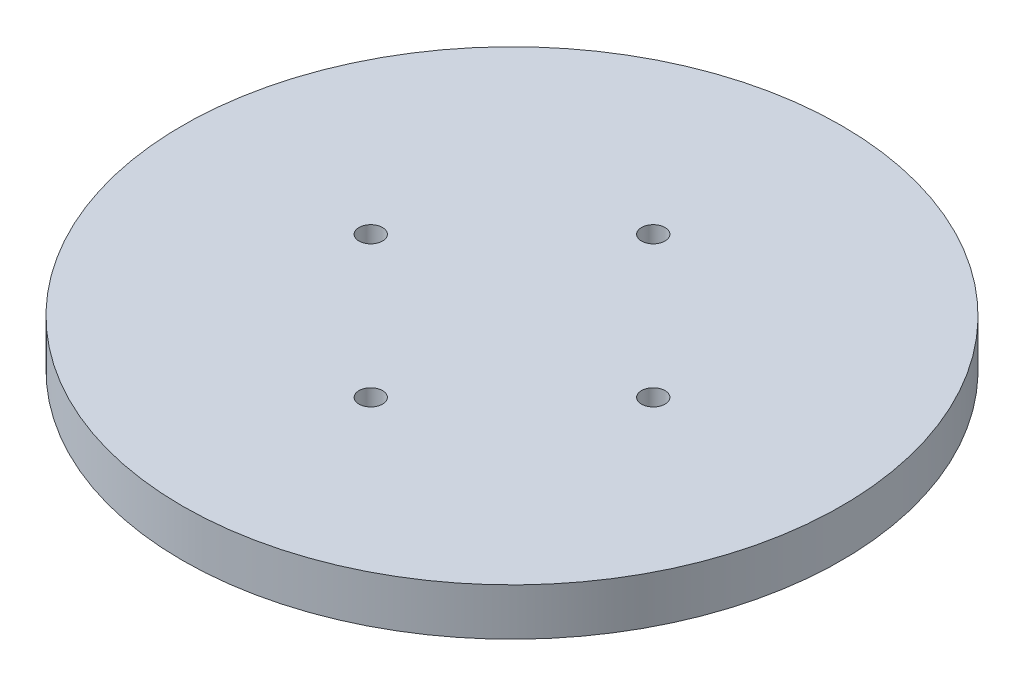
ISO-10303-21;
HEADER;
FILE_DESCRIPTION(('STEP AP214'),'2;1');
FILE_NAME('part.step','',(''),(''),'','','');
FILE_SCHEMA(('AUTOMOTIVE_DESIGN { 1 0 10303 214 1 1 1 1 }'));
ENDSEC;
DATA;
#1=APPLICATION_CONTEXT('core data for automotive mechanical design processes');
#2=APPLICATION_PROTOCOL_DEFINITION('international standard','automotive_design',2000,#1);
#3=PRODUCT_CONTEXT('',#1,'mechanical');
#4=PRODUCT('Part','Part','',(#3));
#5=PRODUCT_RELATED_PRODUCT_CATEGORY('part','',(#4));
#6=PRODUCT_DEFINITION_FORMATION('','',#4);
#7=PRODUCT_DEFINITION_CONTEXT('part definition',#1,'design');
#8=PRODUCT_DEFINITION('design','',#6,#7);
#9=PRODUCT_DEFINITION_SHAPE('','',#8);
#10=(LENGTH_UNIT() NAMED_UNIT(*) SI_UNIT(.MILLI.,.METRE.));
#11=(NAMED_UNIT(*) PLANE_ANGLE_UNIT() SI_UNIT($,.RADIAN.));
#12=(NAMED_UNIT(*) SI_UNIT($,.STERADIAN.) SOLID_ANGLE_UNIT());
#13=UNCERTAINTY_MEASURE_WITH_UNIT(LENGTH_MEASURE(1.E-05),#10,'distance_accuracy_value','');
#14=(GEOMETRIC_REPRESENTATION_CONTEXT(3) GLOBAL_UNCERTAINTY_ASSIGNED_CONTEXT((#13)) GLOBAL_UNIT_ASSIGNED_CONTEXT((#10,
#11,#12)) REPRESENTATION_CONTEXT('',''));
#15=CARTESIAN_POINT('',(0.,0.,0.));
#16=DIRECTION('',(0.,0.,1.));
#17=DIRECTION('',(1.,0.,0.));
#18=AXIS2_PLACEMENT_3D('',#15,#16,#17);
#19=CARTESIAN_POINT('',(0.,10.,0.));
#20=DIRECTION('',(0.,1.,0.));
#21=DIRECTION('',(0.,0.,1.));
#22=AXIS2_PLACEMENT_3D('',#19,#20,#21);
#23=PLANE('',#22);
#24=CARTESIAN_POINT('',(1.69428074463191E-12,10.,30.));
#25=DIRECTION('',(0.,1.,0.));
#26=DIRECTION('',(0.,0.,1.));
#27=AXIS2_PLACEMENT_3D('',#24,#25,#26);
#28=CIRCLE('',#27,2.50000000000182);
#29=CARTESIAN_POINT('',(1.69428074463191E-12,10.,32.5000000000018));
#30=VERTEX_POINT('',#29);
#31=EDGE_CURVE('E52',#30,#30,#28,.T.);
#32=ORIENTED_EDGE('',*,*,#31,.F.);
#33=EDGE_LOOP('',(#32));
#34=FACE_BOUND('',#33,.T.);
#35=CARTESIAN_POINT('',(0.,10.,-30.));
#36=DIRECTION('',(0.,1.,0.));
#37=DIRECTION('',(0.,0.,1.));
#38=AXIS2_PLACEMENT_3D('',#35,#36,#37);
#39=CIRCLE('',#38,2.5);
#40=CARTESIAN_POINT('',(0.,10.,-27.5));
#41=VERTEX_POINT('',#40);
#42=EDGE_CURVE('E41',#41,#41,#39,.T.);
#43=ORIENTED_EDGE('',*,*,#42,.F.);
#44=EDGE_LOOP('',(#43));
#45=FACE_BOUND('',#44,.T.);
#46=CARTESIAN_POINT('',(0.,10.,0.));
#47=DIRECTION('',(0.,1.,0.));
#48=DIRECTION('',(0.,0.,1.));
#49=AXIS2_PLACEMENT_3D('',#46,#47,#48);
#50=CIRCLE('',#49,70.);
#51=CARTESIAN_POINT('',(0.,10.,70.));
#52=VERTEX_POINT('',#51);
#53=EDGE_CURVE('E10',#52,#52,#50,.T.);
#54=ORIENTED_EDGE('',*,*,#53,.T.);
#55=EDGE_LOOP('',(#54));
#56=FACE_BOUND('',#55,.T.);
#57=CARTESIAN_POINT('',(30.,10.,1.04744440165294E-13));
#58=DIRECTION('',(0.,1.,0.));
#59=DIRECTION('',(0.,0.,1.));
#60=AXIS2_PLACEMENT_3D('',#57,#58,#59);
#61=CIRCLE('',#60,2.5);
#62=CARTESIAN_POINT('',(30.,10.,2.50000000000011));
#63=VERTEX_POINT('',#62);
#64=EDGE_CURVE('E46',#63,#63,#61,.T.);
#65=ORIENTED_EDGE('',*,*,#64,.F.);
#66=EDGE_LOOP('',(#65));
#67=FACE_BOUND('',#66,.T.);
#68=CARTESIAN_POINT('',(-30.,10.,-3.14233320495882E-13));
#69=DIRECTION('',(0.,1.,0.));
#70=DIRECTION('',(0.,0.,1.));
#71=AXIS2_PLACEMENT_3D('',#68,#69,#70);
#72=CIRCLE('',#71,2.5);
#73=CARTESIAN_POINT('',(-30.,10.,2.49999999999969));
#74=VERTEX_POINT('',#73);
#75=EDGE_CURVE('E58',#74,#74,#72,.T.);
#76=ORIENTED_EDGE('',*,*,#75,.F.);
#77=EDGE_LOOP('',(#76));
#78=FACE_BOUND('',#77,.T.);
#79=ADVANCED_FACE('F30',(#34,#45,#56,#67,#78),#23,.T.);
#80=CARTESIAN_POINT('',(0.,0.,0.));
#81=DIRECTION('',(0.,1.,0.));
#82=DIRECTION('',(0.,0.,1.));
#83=AXIS2_PLACEMENT_3D('',#80,#81,#82);
#84=PLANE('',#83);
#85=CARTESIAN_POINT('',(0.,0.,0.));
#86=DIRECTION('',(0.,1.,0.));
#87=DIRECTION('',(0.,0.,1.));
#88=AXIS2_PLACEMENT_3D('',#85,#86,#87);
#89=CIRCLE('',#88,70.);
#90=CARTESIAN_POINT('',(0.,0.,70.));
#91=VERTEX_POINT('',#90);
#92=EDGE_CURVE('E34',#91,#91,#89,.T.);
#93=ORIENTED_EDGE('',*,*,#92,.F.);
#94=EDGE_LOOP('',(#93));
#95=FACE_BOUND('',#94,.T.);
#96=CARTESIAN_POINT('',(0.,0.,-30.));
#97=DIRECTION('',(0.,1.,0.));
#98=DIRECTION('',(0.,0.,1.));
#99=AXIS2_PLACEMENT_3D('',#96,#97,#98);
#100=CIRCLE('',#99,2.5);
#101=CARTESIAN_POINT('',(0.,0.,-27.5));
#102=VERTEX_POINT('',#101);
#103=EDGE_CURVE('E43',#102,#102,#100,.T.);
#104=ORIENTED_EDGE('',*,*,#103,.T.);
#105=EDGE_LOOP('',(#104));
#106=FACE_BOUND('',#105,.T.);
#107=CARTESIAN_POINT('',(30.,0.,1.04744440165294E-13));
#108=DIRECTION('',(0.,1.,0.));
#109=DIRECTION('',(0.,0.,1.));
#110=AXIS2_PLACEMENT_3D('',#107,#108,#109);
#111=CIRCLE('',#110,2.5);
#112=CARTESIAN_POINT('',(30.,0.,2.50000000000011));
#113=VERTEX_POINT('',#112);
#114=EDGE_CURVE('E49',#113,#113,#111,.T.);
#115=ORIENTED_EDGE('',*,*,#114,.T.);
#116=EDGE_LOOP('',(#115));
#117=FACE_BOUND('',#116,.T.);
#118=CARTESIAN_POINT('',(1.69428074463191E-12,0.,30.));
#119=DIRECTION('',(0.,1.,0.));
#120=DIRECTION('',(0.,0.,1.));
#121=AXIS2_PLACEMENT_3D('',#118,#119,#120);
#122=CIRCLE('',#121,2.50000000000182);
#123=CARTESIAN_POINT('',(1.69428074463191E-12,0.,32.5000000000018));
#124=VERTEX_POINT('',#123);
#125=EDGE_CURVE('E55',#124,#124,#122,.T.);
#126=ORIENTED_EDGE('',*,*,#125,.T.);
#127=EDGE_LOOP('',(#126));
#128=FACE_BOUND('',#127,.T.);
#129=CARTESIAN_POINT('',(-30.,0.,-3.14233320495882E-13));
#130=DIRECTION('',(0.,1.,0.));
#131=DIRECTION('',(0.,0.,1.));
#132=AXIS2_PLACEMENT_3D('',#129,#130,#131);
#133=CIRCLE('',#132,2.5);
#134=CARTESIAN_POINT('',(-30.,0.,2.49999999999969));
#135=VERTEX_POINT('',#134);
#136=EDGE_CURVE('E61',#135,#135,#133,.T.);
#137=ORIENTED_EDGE('',*,*,#136,.T.);
#138=EDGE_LOOP('',(#137));
#139=FACE_BOUND('',#138,.T.);
#140=ADVANCED_FACE('F71',(#95,#106,#117,#128,#139),#84,.F.);
#141=CARTESIAN_POINT('',(0.,10.,0.));
#142=DIRECTION('',(0.,-1.,0.));
#143=DIRECTION('',(0.,0.,-1.));
#144=AXIS2_PLACEMENT_3D('',#141,#142,#143);
#145=CYLINDRICAL_SURFACE('',#144,70.);
#146=ORIENTED_EDGE('',*,*,#53,.F.);
#147=EDGE_LOOP('',(#146));
#148=FACE_BOUND('',#147,.T.);
#149=ORIENTED_EDGE('',*,*,#92,.T.);
#150=EDGE_LOOP('',(#149));
#151=FACE_BOUND('',#150,.T.);
#152=ADVANCED_FACE('F32',(#148,#151),#145,.T.);
#153=CARTESIAN_POINT('',(0.,10.,-30.));
#154=DIRECTION('',(0.,-1.,0.));
#155=DIRECTION('',(0.,0.,-1.));
#156=AXIS2_PLACEMENT_3D('',#153,#154,#155);
#157=CYLINDRICAL_SURFACE('',#156,2.5);
#158=ORIENTED_EDGE('',*,*,#42,.T.);
#159=EDGE_LOOP('',(#158));
#160=FACE_BOUND('',#159,.T.);
#161=ORIENTED_EDGE('',*,*,#103,.F.);
#162=EDGE_LOOP('',(#161));
#163=FACE_BOUND('',#162,.T.);
#164=ADVANCED_FACE('F81',(#160,#163),#157,.F.);
#165=CARTESIAN_POINT('',(30.,10.,1.04744440165294E-13));
#166=DIRECTION('',(0.,-1.,0.));
#167=DIRECTION('',(0.,0.,-1.));
#168=AXIS2_PLACEMENT_3D('',#165,#166,#167);
#169=CYLINDRICAL_SURFACE('',#168,2.5);
#170=ORIENTED_EDGE('',*,*,#64,.T.);
#171=EDGE_LOOP('',(#170));
#172=FACE_BOUND('',#171,.T.);
#173=ORIENTED_EDGE('',*,*,#114,.F.);
#174=EDGE_LOOP('',(#173));
#175=FACE_BOUND('',#174,.T.);
#176=ADVANCED_FACE('F84',(#172,#175),#169,.F.);
#177=CARTESIAN_POINT('',(1.69428074463191E-12,10.,30.));
#178=DIRECTION('',(0.,-1.,0.));
#179=DIRECTION('',(0.,0.,-1.));
#180=AXIS2_PLACEMENT_3D('',#177,#178,#179);
#181=CYLINDRICAL_SURFACE('',#180,2.50000000000182);
#182=ORIENTED_EDGE('',*,*,#31,.T.);
#183=EDGE_LOOP('',(#182));
#184=FACE_BOUND('',#183,.T.);
#185=ORIENTED_EDGE('',*,*,#125,.F.);
#186=EDGE_LOOP('',(#185));
#187=FACE_BOUND('',#186,.T.);
#188=ADVANCED_FACE('F88',(#184,#187),#181,.F.);
#189=CARTESIAN_POINT('',(-30.,10.,-3.14233320495882E-13));
#190=DIRECTION('',(0.,-1.,0.));
#191=DIRECTION('',(0.,0.,-1.));
#192=AXIS2_PLACEMENT_3D('',#189,#190,#191);
#193=CYLINDRICAL_SURFACE('',#192,2.5);
#194=ORIENTED_EDGE('',*,*,#75,.T.);
#195=EDGE_LOOP('',(#194));
#196=FACE_BOUND('',#195,.T.);
#197=ORIENTED_EDGE('',*,*,#136,.F.);
#198=EDGE_LOOP('',(#197));
#199=FACE_BOUND('',#198,.T.);
#200=ADVANCED_FACE('F67',(#196,#199),#193,.F.);
#201=CLOSED_SHELL('',(#79,#140,#152,#164,#176,#188,#200));
#202=MANIFOLD_SOLID_BREP('B2',#201);
#203=ADVANCED_BREP_SHAPE_REPRESENTATION('',(#18,#202),#14);
#204=SHAPE_DEFINITION_REPRESENTATION(#9,#203);
ENDSEC;
END-ISO-10303-21;
